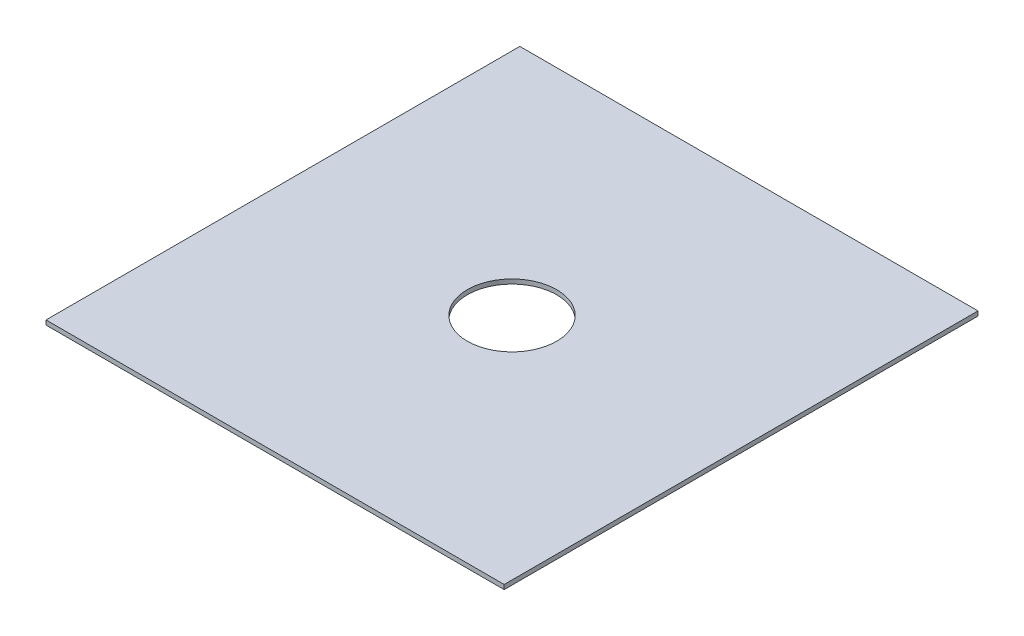
ISO-10303-21;
HEADER;
FILE_DESCRIPTION(('STEP AP214'),'2;1');
FILE_NAME('part.step','',(''),(''),'','','');
FILE_SCHEMA(('AUTOMOTIVE_DESIGN { 1 0 10303 214 1 1 1 1 }'));
ENDSEC;
DATA;
#1=APPLICATION_CONTEXT('core data for automotive mechanical design processes');
#2=APPLICATION_PROTOCOL_DEFINITION('international standard','automotive_design',2000,#1);
#3=PRODUCT_CONTEXT('',#1,'mechanical');
#4=PRODUCT('Part','Part','',(#3));
#5=PRODUCT_RELATED_PRODUCT_CATEGORY('part','',(#4));
#6=PRODUCT_DEFINITION_FORMATION('','',#4);
#7=PRODUCT_DEFINITION_CONTEXT('part definition',#1,'design');
#8=PRODUCT_DEFINITION('design','',#6,#7);
#9=PRODUCT_DEFINITION_SHAPE('','',#8);
#10=(LENGTH_UNIT() NAMED_UNIT(*) SI_UNIT(.MILLI.,.METRE.));
#11=(NAMED_UNIT(*) PLANE_ANGLE_UNIT() SI_UNIT($,.RADIAN.));
#12=(NAMED_UNIT(*) SI_UNIT($,.STERADIAN.) SOLID_ANGLE_UNIT());
#13=UNCERTAINTY_MEASURE_WITH_UNIT(LENGTH_MEASURE(1.E-05),#10,'distance_accuracy_value','');
#14=(GEOMETRIC_REPRESENTATION_CONTEXT(3) GLOBAL_UNCERTAINTY_ASSIGNED_CONTEXT((#13)) GLOBAL_UNIT_ASSIGNED_CONTEXT((#10,
#11,#12)) REPRESENTATION_CONTEXT('',''));
#15=CARTESIAN_POINT('',(0.,0.,0.));
#16=DIRECTION('',(0.,0.,1.));
#17=DIRECTION('',(1.,0.,0.));
#18=AXIS2_PLACEMENT_3D('',#15,#16,#17);
#19=CARTESIAN_POINT('',(162.71875,3.175,-168.275));
#20=DIRECTION('',(-1.,0.,0.));
#21=DIRECTION('',(0.,0.,1.));
#22=AXIS2_PLACEMENT_3D('',#19,#20,#21);
#23=PLANE('',#22);
#24=DIRECTION('',(0.,0.,-1.));
#25=VECTOR('',#24,1.);
#26=CARTESIAN_POINT('',(162.71875,0.,-168.275));
#27=LINE('',#26,#25);
#28=CARTESIAN_POINT('',(162.71875,0.,168.275));
#29=VERTEX_POINT('',#28);
#30=CARTESIAN_POINT('',(162.71875,0.,-168.275));
#31=VERTEX_POINT('',#30);
#32=EDGE_CURVE('E96',#29,#31,#27,.T.);
#33=ORIENTED_EDGE('',*,*,#32,.T.);
#34=DIRECTION('',(0.,-1.,0.));
#35=VECTOR('',#34,1.);
#36=CARTESIAN_POINT('',(162.71875,3.175,-168.275));
#37=LINE('',#36,#35);
#38=CARTESIAN_POINT('',(162.71875,3.175,-168.275));
#39=VERTEX_POINT('',#38);
#40=EDGE_CURVE('E11',#39,#31,#37,.T.);
#41=ORIENTED_EDGE('',*,*,#40,.F.);
#42=DIRECTION('',(0.,0.,-1.));
#43=VECTOR('',#42,1.);
#44=CARTESIAN_POINT('',(162.71875,3.175,-168.275));
#45=LINE('',#44,#43);
#46=CARTESIAN_POINT('',(162.71875,3.175,168.275));
#47=VERTEX_POINT('',#46);
#48=EDGE_CURVE('E84',#47,#39,#45,.T.);
#49=ORIENTED_EDGE('',*,*,#48,.F.);
#50=DIRECTION('',(0.,-1.,0.));
#51=VECTOR('',#50,1.);
#52=CARTESIAN_POINT('',(162.71875,3.175,168.275));
#53=LINE('',#52,#51);
#54=EDGE_CURVE('E92',#47,#29,#53,.T.);
#55=ORIENTED_EDGE('',*,*,#54,.T.);
#56=EDGE_LOOP('',(#33,#41,#49,#55));
#57=FACE_BOUND('',#56,.T.);
#58=ADVANCED_FACE('F33',(#57),#23,.F.);
#59=CARTESIAN_POINT('',(-162.71875,3.175,-168.275));
#60=DIRECTION('',(0.,0.,1.));
#61=DIRECTION('',(1.,0.,0.));
#62=AXIS2_PLACEMENT_3D('',#59,#60,#61);
#63=PLANE('',#62);
#64=DIRECTION('',(-1.,0.,0.));
#65=VECTOR('',#64,1.);
#66=CARTESIAN_POINT('',(-162.71875,0.,-168.275));
#67=LINE('',#66,#65);
#68=CARTESIAN_POINT('',(-162.71875,0.,-168.275));
#69=VERTEX_POINT('',#68);
#70=EDGE_CURVE('E88',#31,#69,#67,.T.);
#71=ORIENTED_EDGE('',*,*,#70,.T.);
#72=DIRECTION('',(0.,-1.,0.));
#73=VECTOR('',#72,1.);
#74=CARTESIAN_POINT('',(-162.71875,3.175,-168.275));
#75=LINE('',#74,#73);
#76=CARTESIAN_POINT('',(-162.71875,3.175,-168.275));
#77=VERTEX_POINT('',#76);
#78=EDGE_CURVE('E41',#77,#69,#75,.T.);
#79=ORIENTED_EDGE('',*,*,#78,.F.);
#80=DIRECTION('',(-1.,0.,0.));
#81=VECTOR('',#80,1.);
#82=CARTESIAN_POINT('',(-162.71875,3.175,-168.275));
#83=LINE('',#82,#81);
#84=EDGE_CURVE('E79',#39,#77,#83,.T.);
#85=ORIENTED_EDGE('',*,*,#84,.F.);
#86=ORIENTED_EDGE('',*,*,#40,.T.);
#87=EDGE_LOOP('',(#71,#79,#85,#86));
#88=FACE_BOUND('',#87,.T.);
#89=ADVANCED_FACE('F87',(#88),#63,.F.);
#90=CARTESIAN_POINT('',(-162.71875,3.175,-168.275));
#91=DIRECTION('',(1.,0.,0.));
#92=DIRECTION('',(0.,0.,-1.));
#93=AXIS2_PLACEMENT_3D('',#90,#91,#92);
#94=PLANE('',#93);
#95=DIRECTION('',(0.,0.,1.));
#96=VECTOR('',#95,1.);
#97=CARTESIAN_POINT('',(-162.71875,0.,-168.275));
#98=LINE('',#97,#96);
#99=CARTESIAN_POINT('',(-162.71875,0.,168.275));
#100=VERTEX_POINT('',#99);
#101=EDGE_CURVE('E66',#69,#100,#98,.T.);
#102=ORIENTED_EDGE('',*,*,#101,.T.);
#103=DIRECTION('',(0.,-1.,0.));
#104=VECTOR('',#103,1.);
#105=CARTESIAN_POINT('',(-162.71875,3.175,168.275));
#106=LINE('',#105,#104);
#107=CARTESIAN_POINT('',(-162.71875,3.175,168.275));
#108=VERTEX_POINT('',#107);
#109=EDGE_CURVE('E89',#108,#100,#106,.T.);
#110=ORIENTED_EDGE('',*,*,#109,.F.);
#111=DIRECTION('',(0.,0.,1.));
#112=VECTOR('',#111,1.);
#113=CARTESIAN_POINT('',(-162.71875,3.175,-168.275));
#114=LINE('',#113,#112);
#115=EDGE_CURVE('E82',#77,#108,#114,.T.);
#116=ORIENTED_EDGE('',*,*,#115,.F.);
#117=ORIENTED_EDGE('',*,*,#78,.T.);
#118=EDGE_LOOP('',(#102,#110,#116,#117));
#119=FACE_BOUND('',#118,.T.);
#120=ADVANCED_FACE('F90',(#119),#94,.F.);
#121=CARTESIAN_POINT('',(-162.71875,3.175,168.275));
#122=DIRECTION('',(0.,0.,-1.));
#123=DIRECTION('',(-1.,0.,0.));
#124=AXIS2_PLACEMENT_3D('',#121,#122,#123);
#125=PLANE('',#124);
#126=DIRECTION('',(1.,0.,0.));
#127=VECTOR('',#126,1.);
#128=CARTESIAN_POINT('',(-162.71875,0.,168.275));
#129=LINE('',#128,#127);
#130=EDGE_CURVE('E72',#100,#29,#129,.T.);
#131=ORIENTED_EDGE('',*,*,#130,.T.);
#132=ORIENTED_EDGE('',*,*,#54,.F.);
#133=DIRECTION('',(1.,0.,0.));
#134=VECTOR('',#133,1.);
#135=CARTESIAN_POINT('',(-162.71875,3.175,168.275));
#136=LINE('',#135,#134);
#137=EDGE_CURVE('E49',#108,#47,#136,.T.);
#138=ORIENTED_EDGE('',*,*,#137,.F.);
#139=ORIENTED_EDGE('',*,*,#109,.T.);
#140=EDGE_LOOP('',(#131,#132,#138,#139));
#141=FACE_BOUND('',#140,.T.);
#142=ADVANCED_FACE('F104',(#141),#125,.F.);
#143=CARTESIAN_POINT('',(0.,3.175,0.));
#144=DIRECTION('',(0.,1.,0.));
#145=DIRECTION('',(0.,0.,1.));
#146=AXIS2_PLACEMENT_3D('',#143,#144,#145);
#147=PLANE('',#146);
#148=CARTESIAN_POINT('',(0.,3.175,0.));
#149=DIRECTION('',(0.,1.,0.));
#150=DIRECTION('',(0.,0.,1.));
#151=AXIS2_PLACEMENT_3D('',#148,#149,#150);
#152=CIRCLE('',#151,31.75);
#153=CARTESIAN_POINT('',(0.,3.175,31.75));
#154=VERTEX_POINT('',#153);
#155=EDGE_CURVE('E110',#154,#154,#152,.T.);
#156=ORIENTED_EDGE('',*,*,#155,.F.);
#157=EDGE_LOOP('',(#156));
#158=FACE_BOUND('',#157,.T.);
#159=ORIENTED_EDGE('',*,*,#48,.T.);
#160=ORIENTED_EDGE('',*,*,#84,.T.);
#161=ORIENTED_EDGE('',*,*,#115,.T.);
#162=ORIENTED_EDGE('',*,*,#137,.T.);
#163=EDGE_LOOP('',(#159,#160,#161,#162));
#164=FACE_BOUND('',#163,.T.);
#165=ADVANCED_FACE('F80',(#158,#164),#147,.T.);
#166=CARTESIAN_POINT('',(0.,0.,0.));
#167=DIRECTION('',(0.,1.,0.));
#168=DIRECTION('',(0.,0.,1.));
#169=AXIS2_PLACEMENT_3D('',#166,#167,#168);
#170=PLANE('',#169);
#171=CARTESIAN_POINT('',(0.,0.,0.));
#172=DIRECTION('',(0.,1.,0.));
#173=DIRECTION('',(0.,0.,1.));
#174=AXIS2_PLACEMENT_3D('',#171,#172,#173);
#175=CIRCLE('',#174,31.75);
#176=CARTESIAN_POINT('',(0.,0.,31.75));
#177=VERTEX_POINT('',#176);
#178=EDGE_CURVE('E99',#177,#177,#175,.T.);
#179=ORIENTED_EDGE('',*,*,#178,.T.);
#180=EDGE_LOOP('',(#179));
#181=FACE_BOUND('',#180,.T.);
#182=ORIENTED_EDGE('',*,*,#32,.F.);
#183=ORIENTED_EDGE('',*,*,#130,.F.);
#184=ORIENTED_EDGE('',*,*,#101,.F.);
#185=ORIENTED_EDGE('',*,*,#70,.F.);
#186=EDGE_LOOP('',(#182,#183,#184,#185));
#187=FACE_BOUND('',#186,.T.);
#188=ADVANCED_FACE('F107',(#181,#187),#170,.F.);
#189=CARTESIAN_POINT('',(0.,0.,0.));
#190=DIRECTION('',(0.,1.,0.));
#191=DIRECTION('',(0.,0.,1.));
#192=AXIS2_PLACEMENT_3D('',#189,#190,#191);
#193=CYLINDRICAL_SURFACE('',#192,31.75);
#194=ORIENTED_EDGE('',*,*,#178,.F.);
#195=EDGE_LOOP('',(#194));
#196=FACE_BOUND('',#195,.T.);
#197=ORIENTED_EDGE('',*,*,#155,.T.);
#198=EDGE_LOOP('',(#197));
#199=FACE_BOUND('',#198,.T.);
#200=ADVANCED_FACE('F117',(#196,#199),#193,.F.);
#201=CLOSED_SHELL('',(#58,#89,#120,#142,#165,#188,#200));
#202=MANIFOLD_SOLID_BREP('B2',#201);
#203=ADVANCED_BREP_SHAPE_REPRESENTATION('',(#18,#202),#14);
#204=SHAPE_DEFINITION_REPRESENTATION(#9,#203);
ENDSEC;
END-ISO-10303-21;
